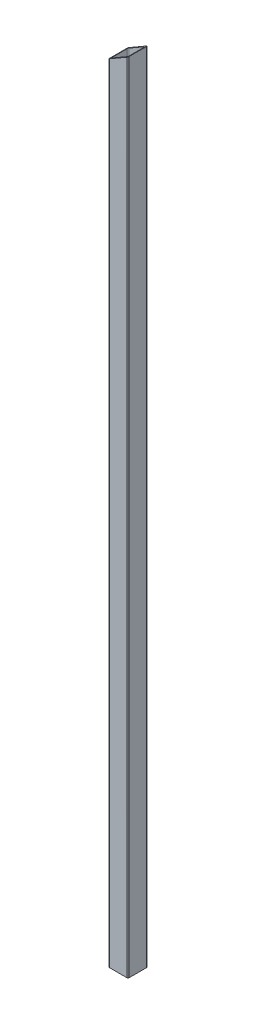
ISO-10303-21;
HEADER;
FILE_DESCRIPTION(('STEP AP214'),'2;1');
FILE_NAME('part.step','',(''),(''),'','','');
FILE_SCHEMA(('AUTOMOTIVE_DESIGN { 1 0 10303 214 1 1 1 1 }'));
ENDSEC;
DATA;
#1=APPLICATION_CONTEXT('core data for automotive mechanical design processes');
#2=APPLICATION_PROTOCOL_DEFINITION('international standard','automotive_design',2000,#1);
#3=PRODUCT_CONTEXT('',#1,'mechanical');
#4=PRODUCT('Part','Part','',(#3));
#5=PRODUCT_RELATED_PRODUCT_CATEGORY('part','',(#4));
#6=PRODUCT_DEFINITION_FORMATION('','',#4);
#7=PRODUCT_DEFINITION_CONTEXT('part definition',#1,'design');
#8=PRODUCT_DEFINITION('design','',#6,#7);
#9=PRODUCT_DEFINITION_SHAPE('','',#8);
#10=(LENGTH_UNIT() NAMED_UNIT(*) SI_UNIT(.MILLI.,.METRE.));
#11=(NAMED_UNIT(*) PLANE_ANGLE_UNIT() SI_UNIT($,.RADIAN.));
#12=(NAMED_UNIT(*) SI_UNIT($,.STERADIAN.) SOLID_ANGLE_UNIT());
#13=UNCERTAINTY_MEASURE_WITH_UNIT(LENGTH_MEASURE(1.E-05),#10,'distance_accuracy_value','');
#14=(GEOMETRIC_REPRESENTATION_CONTEXT(3) GLOBAL_UNCERTAINTY_ASSIGNED_CONTEXT((#13)) GLOBAL_UNIT_ASSIGNED_CONTEXT((#10,
#11,#12)) REPRESENTATION_CONTEXT('',''));
#15=CARTESIAN_POINT('',(0.,0.,0.));
#16=DIRECTION('',(0.,0.,1.));
#17=DIRECTION('',(1.,0.,0.));
#18=AXIS2_PLACEMENT_3D('',#15,#16,#17);
#19=CARTESIAN_POINT('',(-1127.00000000001,-50.,47.));
#20=DIRECTION('',(0.,1.,0.));
#21=DIRECTION('',(0.,0.,1.));
#22=AXIS2_PLACEMENT_3D('',#19,#20,#21);
#23=CYLINDRICAL_SURFACE('',#22,2.99999999999995);
#24=DIRECTION('',(0.,1.,0.));
#25=VECTOR('',#24,1.);
#26=CARTESIAN_POINT('',(-1127.00000000001,-50.,50.));
#27=LINE('',#26,#25);
#28=CARTESIAN_POINT('',(-1127.00000000001,-50.,50.));
#29=VERTEX_POINT('',#28);
#30=CARTESIAN_POINT('',(-1127.00000000001,1972.86453734808,50.));
#31=VERTEX_POINT('',#30);
#32=EDGE_CURVE('E37',#29,#31,#27,.T.);
#33=ORIENTED_EDGE('',*,*,#32,.T.);
#34=CARTESIAN_POINT('',(-1127.00000000001,1972.86453734808,47.));
#35=DIRECTION('',(-0.5,0.866025403784438,0.));
#36=DIRECTION('',(0.866025403784439,0.5,0.));
#37=AXIS2_PLACEMENT_3D('',#34,#35,#36);
#38=ELLIPSE('',#37,3.46410161513769,2.99999999999995);
#39=CARTESIAN_POINT('',(-1130.00000000001,1971.13248654052,47.));
#40=VERTEX_POINT('',#39);
#41=EDGE_CURVE('E166',#31,#40,#38,.F.);
#42=ORIENTED_EDGE('',*,*,#41,.T.);
#43=DIRECTION('',(0.,1.,0.));
#44=VECTOR('',#43,1.);
#45=CARTESIAN_POINT('',(-1130.00000000001,-50.,47.));
#46=LINE('',#45,#44);
#47=CARTESIAN_POINT('',(-1130.00000000001,-50.,47.));
#48=VERTEX_POINT('',#47);
#49=EDGE_CURVE('E11',#48,#40,#46,.T.);
#50=ORIENTED_EDGE('',*,*,#49,.F.);
#51=CARTESIAN_POINT('',(-1127.00000000001,-50.,47.));
#52=DIRECTION('',(0.,1.,0.));
#53=DIRECTION('',(0.,0.,1.));
#54=AXIS2_PLACEMENT_3D('',#51,#52,#53);
#55=CIRCLE('',#54,2.99999999999995);
#56=EDGE_CURVE('E211',#48,#29,#55,.T.);
#57=ORIENTED_EDGE('',*,*,#56,.T.);
#58=EDGE_LOOP('',(#33,#42,#50,#57));
#59=FACE_BOUND('',#58,.T.);
#60=ADVANCED_FACE('F34',(#59),#23,.T.);
#61=CARTESIAN_POINT('',(-1130.00000000001,-50.,3.));
#62=DIRECTION('',(-1.,0.,0.));
#63=DIRECTION('',(0.,0.,1.));
#64=AXIS2_PLACEMENT_3D('',#61,#62,#63);
#65=PLANE('',#64);
#66=ORIENTED_EDGE('',*,*,#49,.T.);
#67=DIRECTION('',(0.,0.,-1.));
#68=VECTOR('',#67,1.);
#69=CARTESIAN_POINT('',(-1130.00000000001,1971.13248654052,50.));
#70=LINE('',#69,#68);
#71=CARTESIAN_POINT('',(-1130.00000000001,1971.13248654052,3.));
#72=VERTEX_POINT('',#71);
#73=EDGE_CURVE('E280',#40,#72,#70,.T.);
#74=ORIENTED_EDGE('',*,*,#73,.T.);
#75=DIRECTION('',(0.,1.,0.));
#76=VECTOR('',#75,1.);
#77=CARTESIAN_POINT('',(-1130.00000000001,-50.,3.));
#78=LINE('',#77,#76);
#79=CARTESIAN_POINT('',(-1130.00000000001,-50.,3.));
#80=VERTEX_POINT('',#79);
#81=EDGE_CURVE('E42',#80,#72,#78,.T.);
#82=ORIENTED_EDGE('',*,*,#81,.F.);
#83=DIRECTION('',(0.,0.,1.));
#84=VECTOR('',#83,1.);
#85=CARTESIAN_POINT('',(-1130.00000000001,-50.,3.));
#86=LINE('',#85,#84);
#87=EDGE_CURVE('E188',#80,#48,#86,.T.);
#88=ORIENTED_EDGE('',*,*,#87,.T.);
#89=EDGE_LOOP('',(#66,#74,#82,#88));
#90=FACE_BOUND('',#89,.T.);
#91=ADVANCED_FACE('F296',(#90),#65,.T.);
#92=CARTESIAN_POINT('',(-1127.00000000001,-50.,3.));
#93=DIRECTION('',(0.,1.,0.));
#94=DIRECTION('',(0.,0.,1.));
#95=AXIS2_PLACEMENT_3D('',#92,#93,#94);
#96=CYLINDRICAL_SURFACE('',#95,2.99999999999995);
#97=ORIENTED_EDGE('',*,*,#81,.T.);
#98=CARTESIAN_POINT('',(-1127.00000000001,1972.86453734808,3.));
#99=DIRECTION('',(-0.5,0.866025403784438,0.));
#100=DIRECTION('',(0.866025403784439,0.5,0.));
#101=AXIS2_PLACEMENT_3D('',#98,#99,#100);
#102=ELLIPSE('',#101,3.4641016151377,2.99999999999995);
#103=CARTESIAN_POINT('',(-1127.00000000001,1972.86453734808,0.));
#104=VERTEX_POINT('',#103);
#105=EDGE_CURVE('E151',#72,#104,#102,.F.);
#106=ORIENTED_EDGE('',*,*,#105,.T.);
#107=DIRECTION('',(0.,1.,0.));
#108=VECTOR('',#107,1.);
#109=CARTESIAN_POINT('',(-1127.00000000001,-50.,0.));
#110=LINE('',#109,#108);
#111=CARTESIAN_POINT('',(-1127.00000000001,-50.,0.));
#112=VERTEX_POINT('',#111);
#113=EDGE_CURVE('E164',#112,#104,#110,.T.);
#114=ORIENTED_EDGE('',*,*,#113,.F.);
#115=CARTESIAN_POINT('',(-1127.00000000001,-50.,3.));
#116=DIRECTION('',(0.,1.,0.));
#117=DIRECTION('',(0.,0.,1.));
#118=AXIS2_PLACEMENT_3D('',#115,#116,#117);
#119=CIRCLE('',#118,2.99999999999995);
#120=EDGE_CURVE('E193',#112,#80,#119,.T.);
#121=ORIENTED_EDGE('',*,*,#120,.T.);
#122=EDGE_LOOP('',(#97,#106,#114,#121));
#123=FACE_BOUND('',#122,.T.);
#124=ADVANCED_FACE('F162',(#123),#96,.T.);
#125=CARTESIAN_POINT('',(-1127.00000000001,-50.,0.));
#126=DIRECTION('',(0.,0.,-1.));
#127=DIRECTION('',(-1.,0.,0.));
#128=AXIS2_PLACEMENT_3D('',#125,#126,#127);
#129=PLANE('',#128);
#130=ORIENTED_EDGE('',*,*,#113,.T.);
#131=DIRECTION('',(0.866025403784438,0.5,0.));
#132=VECTOR('',#131,1.);
#133=CARTESIAN_POINT('',(-1130.00000000001,1971.13248654052,0.));
#134=LINE('',#133,#132);
#135=CARTESIAN_POINT('',(-1083.00000000001,1998.26794919243,0.));
#136=VERTEX_POINT('',#135);
#137=EDGE_CURVE('E148',#104,#136,#134,.T.);
#138=ORIENTED_EDGE('',*,*,#137,.T.);
#139=DIRECTION('',(0.,1.,0.));
#140=VECTOR('',#139,1.);
#141=CARTESIAN_POINT('',(-1083.00000000001,-50.,0.));
#142=LINE('',#141,#140);
#143=CARTESIAN_POINT('',(-1083.00000000001,-50.,0.));
#144=VERTEX_POINT('',#143);
#145=EDGE_CURVE('E172',#144,#136,#142,.T.);
#146=ORIENTED_EDGE('',*,*,#145,.F.);
#147=DIRECTION('',(-1.,0.,0.));
#148=VECTOR('',#147,1.);
#149=CARTESIAN_POINT('',(-1127.00000000001,-50.,0.));
#150=LINE('',#149,#148);
#151=EDGE_CURVE('E171',#144,#112,#150,.T.);
#152=ORIENTED_EDGE('',*,*,#151,.T.);
#153=EDGE_LOOP('',(#130,#138,#146,#152));
#154=FACE_BOUND('',#153,.T.);
#155=ADVANCED_FACE('F169',(#154),#129,.T.);
#156=CARTESIAN_POINT('',(-1083.00000000001,-50.,3.));
#157=DIRECTION('',(0.,1.,0.));
#158=DIRECTION('',(0.,0.,1.));
#159=AXIS2_PLACEMENT_3D('',#156,#157,#158);
#160=CYLINDRICAL_SURFACE('',#159,2.99999999999995);
#161=ORIENTED_EDGE('',*,*,#145,.T.);
#162=CARTESIAN_POINT('',(-1083.00000000001,1998.26794919243,3.));
#163=DIRECTION('',(-0.5,0.866025403784438,0.));
#164=DIRECTION('',(0.866025403784439,0.5,0.));
#165=AXIS2_PLACEMENT_3D('',#162,#163,#164);
#166=ELLIPSE('',#165,3.4641016151377,2.99999999999995);
#167=CARTESIAN_POINT('',(-1080.00000000001,2000.,3.));
#168=VERTEX_POINT('',#167);
#169=EDGE_CURVE('E154',#136,#168,#166,.F.);
#170=ORIENTED_EDGE('',*,*,#169,.T.);
#171=DIRECTION('',(0.,1.,0.));
#172=VECTOR('',#171,1.);
#173=CARTESIAN_POINT('',(-1080.00000000001,-50.,3.));
#174=LINE('',#173,#172);
#175=CARTESIAN_POINT('',(-1080.00000000001,-50.,3.));
#176=VERTEX_POINT('',#175);
#177=EDGE_CURVE('E175',#176,#168,#174,.T.);
#178=ORIENTED_EDGE('',*,*,#177,.F.);
#179=CARTESIAN_POINT('',(-1083.00000000001,-50.,3.));
#180=DIRECTION('',(0.,1.,0.));
#181=DIRECTION('',(0.,0.,-1.));
#182=AXIS2_PLACEMENT_3D('',#179,#180,#181);
#183=CIRCLE('',#182,2.99999999999995);
#184=EDGE_CURVE('E200',#176,#144,#183,.T.);
#185=ORIENTED_EDGE('',*,*,#184,.T.);
#186=EDGE_LOOP('',(#161,#170,#178,#185));
#187=FACE_BOUND('',#186,.T.);
#188=ADVANCED_FACE('F290',(#187),#160,.T.);
#189=CARTESIAN_POINT('',(-1083.00000000001,-50.,47.));
#190=DIRECTION('',(0.,1.,0.));
#191=DIRECTION('',(0.,0.,1.));
#192=AXIS2_PLACEMENT_3D('',#189,#190,#191);
#193=CYLINDRICAL_SURFACE('',#192,2.99999999999995);
#194=DIRECTION('',(0.,1.,0.));
#195=VECTOR('',#194,1.);
#196=CARTESIAN_POINT('',(-1080.00000000001,-50.,47.));
#197=LINE('',#196,#195);
#198=CARTESIAN_POINT('',(-1080.00000000001,-50.,47.));
#199=VERTEX_POINT('',#198);
#200=CARTESIAN_POINT('',(-1080.00000000001,2000.,47.));
#201=VERTEX_POINT('',#200);
#202=EDGE_CURVE('E180',#199,#201,#197,.T.);
#203=ORIENTED_EDGE('',*,*,#202,.T.);
#204=CARTESIAN_POINT('',(-1083.00000000001,1998.26794919243,47.));
#205=DIRECTION('',(-0.5,0.866025403784438,0.));
#206=DIRECTION('',(0.866025403784439,0.5,0.));
#207=AXIS2_PLACEMENT_3D('',#204,#205,#206);
#208=ELLIPSE('',#207,3.46410161513769,2.99999999999995);
#209=CARTESIAN_POINT('',(-1083.00000000001,1998.26794919243,50.));
#210=VERTEX_POINT('',#209);
#211=EDGE_CURVE('E277',#201,#210,#208,.F.);
#212=ORIENTED_EDGE('',*,*,#211,.T.);
#213=DIRECTION('',(0.,1.,0.));
#214=VECTOR('',#213,1.);
#215=CARTESIAN_POINT('',(-1083.00000000001,-50.,50.));
#216=LINE('',#215,#214);
#217=CARTESIAN_POINT('',(-1083.00000000001,-50.,50.));
#218=VERTEX_POINT('',#217);
#219=EDGE_CURVE('E182',#218,#210,#216,.T.);
#220=ORIENTED_EDGE('',*,*,#219,.F.);
#221=CARTESIAN_POINT('',(-1083.00000000001,-50.,47.));
#222=DIRECTION('',(0.,1.,0.));
#223=DIRECTION('',(0.,0.,1.));
#224=AXIS2_PLACEMENT_3D('',#221,#222,#223);
#225=CIRCLE('',#224,2.99999999999995);
#226=EDGE_CURVE('E206',#218,#199,#225,.T.);
#227=ORIENTED_EDGE('',*,*,#226,.T.);
#228=EDGE_LOOP('',(#203,#212,#220,#227));
#229=FACE_BOUND('',#228,.T.);
#230=ADVANCED_FACE('F283',(#229),#193,.T.);
#231=CARTESIAN_POINT('',(-1127.00000000001,-50.,50.));
#232=DIRECTION('',(0.,0.,1.));
#233=DIRECTION('',(1.,0.,0.));
#234=AXIS2_PLACEMENT_3D('',#231,#232,#233);
#235=PLANE('',#234);
#236=ORIENTED_EDGE('',*,*,#219,.T.);
#237=DIRECTION('',(0.866025403784438,0.5,0.));
#238=VECTOR('',#237,1.);
#239=CARTESIAN_POINT('',(-1130.00000000001,1971.13248654052,50.));
#240=LINE('',#239,#238);
#241=EDGE_CURVE('E158',#31,#210,#240,.T.);
#242=ORIENTED_EDGE('',*,*,#241,.F.);
#243=ORIENTED_EDGE('',*,*,#32,.F.);
#244=DIRECTION('',(1.,0.,0.));
#245=VECTOR('',#244,1.);
#246=CARTESIAN_POINT('',(-1127.00000000001,-50.,50.));
#247=LINE('',#246,#245);
#248=EDGE_CURVE('E209',#29,#218,#247,.T.);
#249=ORIENTED_EDGE('',*,*,#248,.T.);
#250=EDGE_LOOP('',(#236,#242,#243,#249));
#251=FACE_BOUND('',#250,.T.);
#252=ADVANCED_FACE('F315',(#251),#235,.T.);
#253=CARTESIAN_POINT('',(-1125.00000000001,-50.,45.));
#254=DIRECTION('',(0.,1.,0.));
#255=DIRECTION('',(0.,0.,1.));
#256=AXIS2_PLACEMENT_3D('',#253,#254,#255);
#257=CYLINDRICAL_SURFACE('',#256,2.);
#258=CARTESIAN_POINT('',(-1125.00000000001,1974.01923788646,45.));
#259=DIRECTION('',(-0.5,0.866025403784438,0.));
#260=DIRECTION('',(0.866025403784439,0.5,0.));
#261=AXIS2_PLACEMENT_3D('',#258,#259,#260);
#262=ELLIPSE('',#261,2.30940107675851,2.);
#263=CARTESIAN_POINT('',(-1125.00000000001,1974.01923788646,47.));
#264=VERTEX_POINT('',#263);
#265=CARTESIAN_POINT('',(-1127.00000000001,1972.86453734808,45.));
#266=VERTEX_POINT('',#265);
#267=EDGE_CURVE('E262',#264,#266,#262,.F.);
#268=ORIENTED_EDGE('',*,*,#267,.F.);
#269=DIRECTION('',(0.,1.,0.));
#270=VECTOR('',#269,1.);
#271=CARTESIAN_POINT('',(-1125.00000000001,-50.,47.));
#272=LINE('',#271,#270);
#273=CARTESIAN_POINT('',(-1125.00000000001,-50.,47.));
#274=VERTEX_POINT('',#273);
#275=EDGE_CURVE('E214',#274,#264,#272,.T.);
#276=ORIENTED_EDGE('',*,*,#275,.F.);
#277=CARTESIAN_POINT('',(-1125.00000000001,-50.,45.));
#278=DIRECTION('',(0.,1.,0.));
#279=DIRECTION('',(0.,0.,1.));
#280=AXIS2_PLACEMENT_3D('',#277,#278,#279);
#281=CIRCLE('',#280,2.);
#282=CARTESIAN_POINT('',(-1127.00000000001,-50.,45.));
#283=VERTEX_POINT('',#282);
#284=EDGE_CURVE('E255',#283,#274,#281,.T.);
#285=ORIENTED_EDGE('',*,*,#284,.F.);
#286=DIRECTION('',(0.,1.,0.));
#287=VECTOR('',#286,1.);
#288=CARTESIAN_POINT('',(-1127.00000000001,-50.,45.));
#289=LINE('',#288,#287);
#290=EDGE_CURVE('E213',#283,#266,#289,.T.);
#291=ORIENTED_EDGE('',*,*,#290,.T.);
#292=EDGE_LOOP('',(#268,#276,#285,#291));
#293=FACE_BOUND('',#292,.T.);
#294=ADVANCED_FACE('F317',(#293),#257,.F.);
#295=CARTESIAN_POINT('',(-1127.00000000001,-50.,5.));
#296=DIRECTION('',(-1.,0.,0.));
#297=DIRECTION('',(0.,0.,1.));
#298=AXIS2_PLACEMENT_3D('',#295,#296,#297);
#299=PLANE('',#298);
#300=DIRECTION('',(0.,0.,-1.));
#301=VECTOR('',#300,1.);
#302=CARTESIAN_POINT('',(-1127.00000000001,1972.86453734808,5.));
#303=LINE('',#302,#301);
#304=CARTESIAN_POINT('',(-1127.00000000001,1972.86453734808,5.));
#305=VERTEX_POINT('',#304);
#306=EDGE_CURVE('E264',#266,#305,#303,.T.);
#307=ORIENTED_EDGE('',*,*,#306,.F.);
#308=ORIENTED_EDGE('',*,*,#290,.F.);
#309=DIRECTION('',(0.,0.,1.));
#310=VECTOR('',#309,1.);
#311=CARTESIAN_POINT('',(-1127.00000000001,-50.,5.));
#312=LINE('',#311,#310);
#313=CARTESIAN_POINT('',(-1127.00000000001,-50.,5.));
#314=VERTEX_POINT('',#313);
#315=EDGE_CURVE('E218',#314,#283,#312,.T.);
#316=ORIENTED_EDGE('',*,*,#315,.F.);
#317=DIRECTION('',(0.,1.,0.));
#318=VECTOR('',#317,1.);
#319=CARTESIAN_POINT('',(-1127.00000000001,-50.,5.));
#320=LINE('',#319,#318);
#321=EDGE_CURVE('E232',#314,#305,#320,.T.);
#322=ORIENTED_EDGE('',*,*,#321,.T.);
#323=EDGE_LOOP('',(#307,#308,#316,#322));
#324=FACE_BOUND('',#323,.T.);
#325=ADVANCED_FACE('F321',(#324),#299,.F.);
#326=CARTESIAN_POINT('',(-1125.00000000001,-50.,5.));
#327=DIRECTION('',(0.,1.,0.));
#328=DIRECTION('',(0.,0.,1.));
#329=AXIS2_PLACEMENT_3D('',#326,#327,#328);
#330=CYLINDRICAL_SURFACE('',#329,2.);
#331=CARTESIAN_POINT('',(-1125.00000000001,1974.01923788646,5.));
#332=DIRECTION('',(-0.5,0.866025403784438,0.));
#333=DIRECTION('',(0.866025403784439,0.5,0.));
#334=AXIS2_PLACEMENT_3D('',#331,#332,#333);
#335=ELLIPSE('',#334,2.30940107675851,2.);
#336=CARTESIAN_POINT('',(-1125.00000000001,1974.01923788646,3.));
#337=VERTEX_POINT('',#336);
#338=EDGE_CURVE('E266',#305,#337,#335,.F.);
#339=ORIENTED_EDGE('',*,*,#338,.F.);
#340=ORIENTED_EDGE('',*,*,#321,.F.);
#341=CARTESIAN_POINT('',(-1125.00000000001,-50.,5.));
#342=DIRECTION('',(0.,1.,0.));
#343=DIRECTION('',(0.,0.,1.));
#344=AXIS2_PLACEMENT_3D('',#341,#342,#343);
#345=CIRCLE('',#344,2.);
#346=CARTESIAN_POINT('',(-1125.00000000001,-50.,3.));
#347=VERTEX_POINT('',#346);
#348=EDGE_CURVE('E239',#347,#314,#345,.T.);
#349=ORIENTED_EDGE('',*,*,#348,.F.);
#350=DIRECTION('',(0.,1.,0.));
#351=VECTOR('',#350,1.);
#352=CARTESIAN_POINT('',(-1125.00000000001,-50.,3.));
#353=LINE('',#352,#351);
#354=EDGE_CURVE('E229',#347,#337,#353,.T.);
#355=ORIENTED_EDGE('',*,*,#354,.T.);
#356=EDGE_LOOP('',(#339,#340,#349,#355));
#357=FACE_BOUND('',#356,.T.);
#358=ADVANCED_FACE('F326',(#357),#330,.F.);
#359=CARTESIAN_POINT('',(-1125.00000000001,-50.,3.));
#360=DIRECTION('',(0.,0.,-1.));
#361=DIRECTION('',(-1.,0.,0.));
#362=AXIS2_PLACEMENT_3D('',#359,#360,#361);
#363=PLANE('',#362);
#364=DIRECTION('',(0.866025403784439,0.5,0.));
#365=VECTOR('',#364,1.);
#366=CARTESIAN_POINT('',(-2001.42603887906,1468.01442841485,3.));
#367=LINE('',#366,#365);
#368=CARTESIAN_POINT('',(-1085.00000000001,1997.11324865405,3.));
#369=VERTEX_POINT('',#368);
#370=EDGE_CURVE('E268',#337,#369,#367,.T.);
#371=ORIENTED_EDGE('',*,*,#370,.F.);
#372=ORIENTED_EDGE('',*,*,#354,.F.);
#373=DIRECTION('',(-1.,0.,0.));
#374=VECTOR('',#373,1.);
#375=CARTESIAN_POINT('',(-1125.00000000001,-50.,3.));
#376=LINE('',#375,#374);
#377=CARTESIAN_POINT('',(-1085.00000000001,-50.,3.));
#378=VERTEX_POINT('',#377);
#379=EDGE_CURVE('E242',#378,#347,#376,.T.);
#380=ORIENTED_EDGE('',*,*,#379,.F.);
#381=DIRECTION('',(0.,1.,0.));
#382=VECTOR('',#381,1.);
#383=CARTESIAN_POINT('',(-1085.00000000001,-50.,3.));
#384=LINE('',#383,#382);
#385=EDGE_CURVE('E226',#378,#369,#384,.T.);
#386=ORIENTED_EDGE('',*,*,#385,.T.);
#387=EDGE_LOOP('',(#371,#372,#380,#386));
#388=FACE_BOUND('',#387,.T.);
#389=ADVANCED_FACE('F344',(#388),#363,.F.);
#390=CARTESIAN_POINT('',(-1085.00000000001,-50.,5.));
#391=DIRECTION('',(0.,1.,0.));
#392=DIRECTION('',(0.,0.,1.));
#393=AXIS2_PLACEMENT_3D('',#390,#391,#392);
#394=CYLINDRICAL_SURFACE('',#393,2.);
#395=CARTESIAN_POINT('',(-1085.00000000001,1997.11324865405,5.));
#396=DIRECTION('',(-0.5,0.866025403784438,0.));
#397=DIRECTION('',(0.866025403784439,0.5,0.));
#398=AXIS2_PLACEMENT_3D('',#395,#396,#397);
#399=ELLIPSE('',#398,2.30940107675851,2.);
#400=CARTESIAN_POINT('',(-1083.00000000001,1998.26794919243,5.));
#401=VERTEX_POINT('',#400);
#402=EDGE_CURVE('E270',#369,#401,#399,.F.);
#403=ORIENTED_EDGE('',*,*,#402,.F.);
#404=ORIENTED_EDGE('',*,*,#385,.F.);
#405=CARTESIAN_POINT('',(-1085.00000000001,-50.,5.));
#406=DIRECTION('',(0.,1.,0.));
#407=DIRECTION('',(0.,0.,-1.));
#408=AXIS2_PLACEMENT_3D('',#405,#406,#407);
#409=CIRCLE('',#408,2.);
#410=CARTESIAN_POINT('',(-1083.00000000001,-50.,5.));
#411=VERTEX_POINT('',#410);
#412=EDGE_CURVE('E245',#411,#378,#409,.T.);
#413=ORIENTED_EDGE('',*,*,#412,.F.);
#414=DIRECTION('',(0.,1.,0.));
#415=VECTOR('',#414,1.);
#416=CARTESIAN_POINT('',(-1083.00000000001,-50.,5.));
#417=LINE('',#416,#415);
#418=EDGE_CURVE('E223',#411,#401,#417,.T.);
#419=ORIENTED_EDGE('',*,*,#418,.T.);
#420=EDGE_LOOP('',(#403,#404,#413,#419));
#421=FACE_BOUND('',#420,.T.);
#422=ADVANCED_FACE('F340',(#421),#394,.F.);
#423=CARTESIAN_POINT('',(-1083.00000000001,-50.,5.));
#424=DIRECTION('',(1.,0.,0.));
#425=DIRECTION('',(0.,0.,-1.));
#426=AXIS2_PLACEMENT_3D('',#423,#424,#425);
#427=PLANE('',#426);
#428=DIRECTION('',(0.,0.,1.));
#429=VECTOR('',#428,1.);
#430=CARTESIAN_POINT('',(-1083.00000000001,1998.26794919243,5.));
#431=LINE('',#430,#429);
#432=CARTESIAN_POINT('',(-1083.00000000001,1998.26794919243,45.));
#433=VERTEX_POINT('',#432);
#434=EDGE_CURVE('E272',#401,#433,#431,.T.);
#435=ORIENTED_EDGE('',*,*,#434,.F.);
#436=ORIENTED_EDGE('',*,*,#418,.F.);
#437=DIRECTION('',(0.,0.,-1.));
#438=VECTOR('',#437,1.);
#439=CARTESIAN_POINT('',(-1083.00000000001,-50.,5.));
#440=LINE('',#439,#438);
#441=CARTESIAN_POINT('',(-1083.00000000001,-50.,45.));
#442=VERTEX_POINT('',#441);
#443=EDGE_CURVE('E248',#442,#411,#440,.T.);
#444=ORIENTED_EDGE('',*,*,#443,.F.);
#445=DIRECTION('',(0.,1.,0.));
#446=VECTOR('',#445,1.);
#447=CARTESIAN_POINT('',(-1083.00000000001,-50.,45.));
#448=LINE('',#447,#446);
#449=EDGE_CURVE('E220',#442,#433,#448,.T.);
#450=ORIENTED_EDGE('',*,*,#449,.T.);
#451=EDGE_LOOP('',(#435,#436,#444,#450));
#452=FACE_BOUND('',#451,.T.);
#453=ADVANCED_FACE('F337',(#452),#427,.F.);
#454=CARTESIAN_POINT('',(-1085.00000000001,-50.,45.));
#455=DIRECTION('',(0.,1.,0.));
#456=DIRECTION('',(0.,0.,1.));
#457=AXIS2_PLACEMENT_3D('',#454,#455,#456);
#458=CYLINDRICAL_SURFACE('',#457,2.);
#459=CARTESIAN_POINT('',(-1085.00000000001,1997.11324865405,45.));
#460=DIRECTION('',(-0.5,0.866025403784438,0.));
#461=DIRECTION('',(0.866025403784439,0.5,0.));
#462=AXIS2_PLACEMENT_3D('',#459,#460,#461);
#463=ELLIPSE('',#462,2.30940107675851,2.);
#464=CARTESIAN_POINT('',(-1085.00000000001,1997.11324865405,47.));
#465=VERTEX_POINT('',#464);
#466=EDGE_CURVE('E50',#433,#465,#463,.F.);
#467=ORIENTED_EDGE('',*,*,#466,.F.);
#468=ORIENTED_EDGE('',*,*,#449,.F.);
#469=CARTESIAN_POINT('',(-1085.00000000001,-50.,45.));
#470=DIRECTION('',(0.,1.,0.));
#471=DIRECTION('',(0.,0.,1.));
#472=AXIS2_PLACEMENT_3D('',#469,#470,#471);
#473=CIRCLE('',#472,2.);
#474=CARTESIAN_POINT('',(-1085.00000000001,-50.,47.));
#475=VERTEX_POINT('',#474);
#476=EDGE_CURVE('E58',#475,#442,#473,.T.);
#477=ORIENTED_EDGE('',*,*,#476,.F.);
#478=DIRECTION('',(0.,1.,0.));
#479=VECTOR('',#478,1.);
#480=CARTESIAN_POINT('',(-1085.00000000001,-50.,47.));
#481=LINE('',#480,#479);
#482=EDGE_CURVE('E217',#475,#465,#481,.T.);
#483=ORIENTED_EDGE('',*,*,#482,.T.);
#484=EDGE_LOOP('',(#467,#468,#477,#483));
#485=FACE_BOUND('',#484,.T.);
#486=ADVANCED_FACE('F333',(#485),#458,.F.);
#487=CARTESIAN_POINT('',(-1125.00000000001,-50.,47.));
#488=DIRECTION('',(0.,0.,1.));
#489=DIRECTION('',(1.,0.,0.));
#490=AXIS2_PLACEMENT_3D('',#487,#488,#489);
#491=PLANE('',#490);
#492=DIRECTION('',(-0.866025403784439,-0.5,0.));
#493=VECTOR('',#492,1.);
#494=CARTESIAN_POINT('',(-2001.42603887906,1468.01442841485,47.));
#495=LINE('',#494,#493);
#496=EDGE_CURVE('E275',#465,#264,#495,.T.);
#497=ORIENTED_EDGE('',*,*,#496,.F.);
#498=ORIENTED_EDGE('',*,*,#482,.F.);
#499=DIRECTION('',(1.,0.,0.));
#500=VECTOR('',#499,1.);
#501=CARTESIAN_POINT('',(-1125.00000000001,-50.,47.));
#502=LINE('',#501,#500);
#503=EDGE_CURVE('E252',#274,#475,#502,.T.);
#504=ORIENTED_EDGE('',*,*,#503,.F.);
#505=ORIENTED_EDGE('',*,*,#275,.T.);
#506=EDGE_LOOP('',(#497,#498,#504,#505));
#507=FACE_BOUND('',#506,.T.);
#508=ADVANCED_FACE('F313',(#507),#491,.F.);
#509=CARTESIAN_POINT('',(-1080.00000000001,-50.,3.));
#510=DIRECTION('',(1.,0.,0.));
#511=DIRECTION('',(0.,0.,-1.));
#512=AXIS2_PLACEMENT_3D('',#509,#510,#511);
#513=PLANE('',#512);
#514=ORIENTED_EDGE('',*,*,#177,.T.);
#515=DIRECTION('',(0.,0.,-1.));
#516=VECTOR('',#515,1.);
#517=CARTESIAN_POINT('',(-1080.00000000001,2000.,3.));
#518=LINE('',#517,#516);
#519=EDGE_CURVE('E258',#201,#168,#518,.T.);
#520=ORIENTED_EDGE('',*,*,#519,.F.);
#521=ORIENTED_EDGE('',*,*,#202,.F.);
#522=DIRECTION('',(0.,0.,-1.));
#523=VECTOR('',#522,1.);
#524=CARTESIAN_POINT('',(-1080.00000000001,-50.,3.));
#525=LINE('',#524,#523);
#526=EDGE_CURVE('E203',#199,#176,#525,.T.);
#527=ORIENTED_EDGE('',*,*,#526,.T.);
#528=EDGE_LOOP('',(#514,#520,#521,#527));
#529=FACE_BOUND('',#528,.T.);
#530=ADVANCED_FACE('F288',(#529),#513,.T.);
#531=CARTESIAN_POINT('',(-1127.00000000001,-50.,47.));
#532=DIRECTION('',(0.,1.,0.));
#533=DIRECTION('',(0.,0.,1.));
#534=AXIS2_PLACEMENT_3D('',#531,#532,#533);
#535=PLANE('',#534);
#536=ORIENTED_EDGE('',*,*,#315,.T.);
#537=ORIENTED_EDGE('',*,*,#284,.T.);
#538=ORIENTED_EDGE('',*,*,#503,.T.);
#539=ORIENTED_EDGE('',*,*,#476,.T.);
#540=ORIENTED_EDGE('',*,*,#443,.T.);
#541=ORIENTED_EDGE('',*,*,#412,.T.);
#542=ORIENTED_EDGE('',*,*,#379,.T.);
#543=ORIENTED_EDGE('',*,*,#348,.T.);
#544=EDGE_LOOP('',(#536,#537,#538,#539,#540,#541,#542,#543));
#545=FACE_BOUND('',#544,.T.);
#546=ORIENTED_EDGE('',*,*,#56,.F.);
#547=ORIENTED_EDGE('',*,*,#87,.F.);
#548=ORIENTED_EDGE('',*,*,#120,.F.);
#549=ORIENTED_EDGE('',*,*,#151,.F.);
#550=ORIENTED_EDGE('',*,*,#184,.F.);
#551=ORIENTED_EDGE('',*,*,#526,.F.);
#552=ORIENTED_EDGE('',*,*,#226,.F.);
#553=ORIENTED_EDGE('',*,*,#248,.F.);
#554=EDGE_LOOP('',(#546,#547,#548,#549,#550,#551,#552,#553));
#555=FACE_BOUND('',#554,.T.);
#556=ADVANCED_FACE('F294',(#545,#555),#535,.F.);
#557=CARTESIAN_POINT('',(-1130.00000000001,1971.13248654052,50.));
#558=DIRECTION('',(-0.5,0.866025403784438,0.));
#559=DIRECTION('',(-0.866025403784439,-0.5,0.));
#560=AXIS2_PLACEMENT_3D('',#557,#558,#559);
#561=PLANE('',#560);
#562=ORIENTED_EDGE('',*,*,#241,.T.);
#563=ORIENTED_EDGE('',*,*,#211,.F.);
#564=ORIENTED_EDGE('',*,*,#519,.T.);
#565=ORIENTED_EDGE('',*,*,#169,.F.);
#566=ORIENTED_EDGE('',*,*,#137,.F.);
#567=ORIENTED_EDGE('',*,*,#105,.F.);
#568=ORIENTED_EDGE('',*,*,#73,.F.);
#569=ORIENTED_EDGE('',*,*,#41,.F.);
#570=EDGE_LOOP('',(#562,#563,#564,#565,#566,#567,#568,#569));
#571=FACE_BOUND('',#570,.T.);
#572=ORIENTED_EDGE('',*,*,#267,.T.);
#573=ORIENTED_EDGE('',*,*,#306,.T.);
#574=ORIENTED_EDGE('',*,*,#338,.T.);
#575=ORIENTED_EDGE('',*,*,#370,.T.);
#576=ORIENTED_EDGE('',*,*,#402,.T.);
#577=ORIENTED_EDGE('',*,*,#434,.T.);
#578=ORIENTED_EDGE('',*,*,#466,.T.);
#579=ORIENTED_EDGE('',*,*,#496,.T.);
#580=EDGE_LOOP('',(#572,#573,#574,#575,#576,#577,#578,#579));
#581=FACE_BOUND('',#580,.T.);
#582=ADVANCED_FACE('F150',(#571,#581),#561,.T.);
#583=CLOSED_SHELL('',(#60,#91,#124,#155,#188,#230,#252,#294,#325,#358,#389,#422,#453,#486,#508,
#530,#556,#582));
#584=MANIFOLD_SOLID_BREP('B2',#583);
#585=ADVANCED_BREP_SHAPE_REPRESENTATION('',(#18,#584),#14);
#586=SHAPE_DEFINITION_REPRESENTATION(#9,#585);
ENDSEC;
END-ISO-10303-21;
